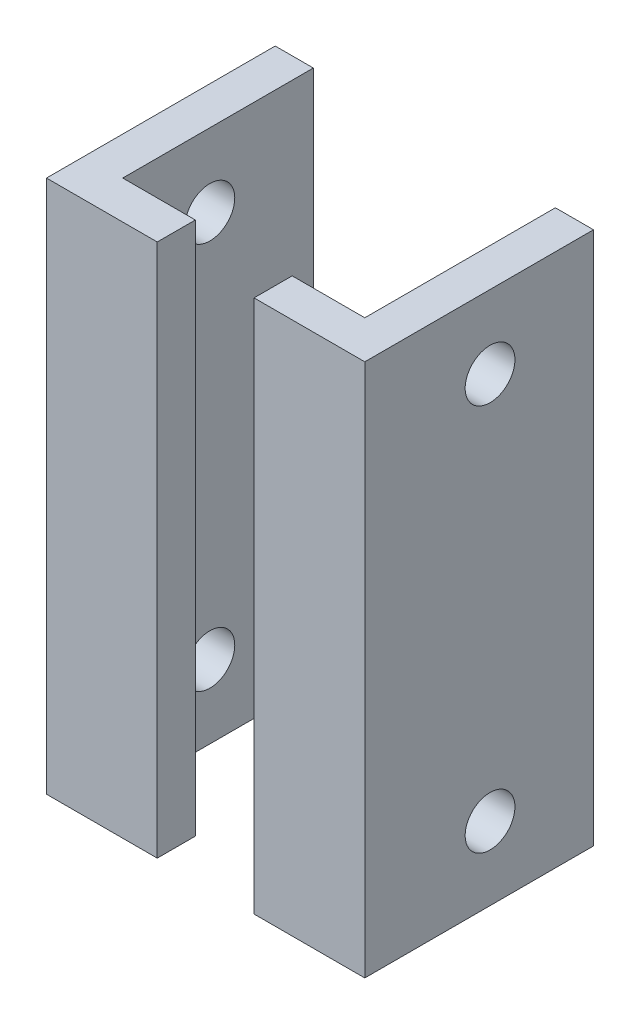
ISO-10303-21;
HEADER;
FILE_DESCRIPTION(('STEP AP214'),'2;1');
FILE_NAME('part.step','',(''),(''),'','','');
FILE_SCHEMA(('AUTOMOTIVE_DESIGN { 1 0 10303 214 1 1 1 1 }'));
ENDSEC;
DATA;
#1=APPLICATION_CONTEXT('core data for automotive mechanical design processes');
#2=APPLICATION_PROTOCOL_DEFINITION('international standard','automotive_design',2000,#1);
#3=PRODUCT_CONTEXT('',#1,'mechanical');
#4=PRODUCT('Part','Part','',(#3));
#5=PRODUCT_RELATED_PRODUCT_CATEGORY('part','',(#4));
#6=PRODUCT_DEFINITION_FORMATION('','',#4);
#7=PRODUCT_DEFINITION_CONTEXT('part definition',#1,'design');
#8=PRODUCT_DEFINITION('design','',#6,#7);
#9=PRODUCT_DEFINITION_SHAPE('','',#8);
#10=(LENGTH_UNIT() NAMED_UNIT(*) SI_UNIT(.MILLI.,.METRE.));
#11=(NAMED_UNIT(*) PLANE_ANGLE_UNIT() SI_UNIT($,.RADIAN.));
#12=(NAMED_UNIT(*) SI_UNIT($,.STERADIAN.) SOLID_ANGLE_UNIT());
#13=UNCERTAINTY_MEASURE_WITH_UNIT(LENGTH_MEASURE(1.E-05),#10,'distance_accuracy_value','');
#14=(GEOMETRIC_REPRESENTATION_CONTEXT(3) GLOBAL_UNCERTAINTY_ASSIGNED_CONTEXT((#13)) GLOBAL_UNIT_ASSIGNED_CONTEXT((#10,
#11,#12)) REPRESENTATION_CONTEXT('',''));
#15=CARTESIAN_POINT('',(0.,0.,0.));
#16=DIRECTION('',(0.,0.,1.));
#17=DIRECTION('',(1.,0.,0.));
#18=AXIS2_PLACEMENT_3D('',#15,#16,#17);
#19=CARTESIAN_POINT('',(-20.875,0.,0.));
#20=DIRECTION('',(1.,0.,0.));
#21=DIRECTION('',(0.,0.,1.));
#22=AXIS2_PLACEMENT_3D('',#19,#20,#21);
#23=PLANE('',#22);
#24=DIRECTION('',(0.,-1.,0.));
#25=VECTOR('',#24,1.);
#26=CARTESIAN_POINT('',(-20.875,244.4,49.45));
#27=LINE('',#26,#25);
#28=CARTESIAN_POINT('',(-20.875,314.4,49.45));
#29=VERTEX_POINT('',#28);
#30=CARTESIAN_POINT('',(-20.875,244.4,49.45));
#31=VERTEX_POINT('',#30);
#32=EDGE_CURVE('E126',#29,#31,#27,.T.);
#33=ORIENTED_EDGE('',*,*,#32,.F.);
#34=DIRECTION('',(0.,0.,1.));
#35=VECTOR('',#34,1.);
#36=CARTESIAN_POINT('',(-20.875,314.4,49.45));
#37=LINE('',#36,#35);
#38=CARTESIAN_POINT('',(-20.875,314.4,19.45));
#39=VERTEX_POINT('',#38);
#40=EDGE_CURVE('E141',#39,#29,#37,.T.);
#41=ORIENTED_EDGE('',*,*,#40,.F.);
#42=DIRECTION('',(0.,1.,0.));
#43=VECTOR('',#42,1.);
#44=CARTESIAN_POINT('',(-20.875,314.4,19.45));
#45=LINE('',#44,#43);
#46=CARTESIAN_POINT('',(-20.875,244.4,19.45));
#47=VERTEX_POINT('',#46);
#48=EDGE_CURVE('E132',#47,#39,#45,.T.);
#49=ORIENTED_EDGE('',*,*,#48,.F.);
#50=DIRECTION('',(0.,0.,-1.));
#51=VECTOR('',#50,1.);
#52=CARTESIAN_POINT('',(-20.875,244.4,19.45));
#53=LINE('',#52,#51);
#54=EDGE_CURVE('E129',#31,#47,#53,.T.);
#55=ORIENTED_EDGE('',*,*,#54,.F.);
#56=EDGE_LOOP('',(#33,#41,#49,#55));
#57=FACE_BOUND('',#56,.T.);
#58=CARTESIAN_POINT('',(-20.875,254.,33.02));
#59=DIRECTION('',(1.,0.,0.));
#60=DIRECTION('',(0.,0.,-1.));
#61=AXIS2_PLACEMENT_3D('',#58,#59,#60);
#62=CIRCLE('',#61,3.2639);
#63=CARTESIAN_POINT('',(-20.875,254.,29.7561));
#64=VERTEX_POINT('',#63);
#65=EDGE_CURVE('E146',#64,#64,#62,.T.);
#66=ORIENTED_EDGE('',*,*,#65,.T.);
#67=EDGE_LOOP('',(#66));
#68=FACE_BOUND('',#67,.T.);
#69=CARTESIAN_POINT('',(-20.875,304.8,33.02));
#70=DIRECTION('',(1.,0.,0.));
#71=DIRECTION('',(0.,0.,-1.));
#72=AXIS2_PLACEMENT_3D('',#69,#70,#71);
#73=CIRCLE('',#72,3.2639);
#74=CARTESIAN_POINT('',(-20.875,304.8,29.7561));
#75=VERTEX_POINT('',#74);
#76=EDGE_CURVE('E165',#75,#75,#73,.T.);
#77=ORIENTED_EDGE('',*,*,#76,.T.);
#78=EDGE_LOOP('',(#77));
#79=FACE_BOUND('',#78,.T.);
#80=ADVANCED_FACE('F49',(#57,#68,#79),#23,.F.);
#81=CARTESIAN_POINT('',(-15.875,0.,0.));
#82=DIRECTION('',(1.,0.,0.));
#83=DIRECTION('',(0.,0.,1.));
#84=AXIS2_PLACEMENT_3D('',#81,#82,#83);
#85=PLANE('',#84);
#86=DIRECTION('',(0.,-1.,0.));
#87=VECTOR('',#86,1.);
#88=CARTESIAN_POINT('',(-15.875,314.4,44.45));
#89=LINE('',#88,#87);
#90=CARTESIAN_POINT('',(-15.875,314.4,44.45));
#91=VERTEX_POINT('',#90);
#92=CARTESIAN_POINT('',(-15.875,244.4,44.45));
#93=VERTEX_POINT('',#92);
#94=EDGE_CURVE('E157',#91,#93,#89,.T.);
#95=ORIENTED_EDGE('',*,*,#94,.T.);
#96=DIRECTION('',(0.,0.,-1.));
#97=VECTOR('',#96,1.);
#98=CARTESIAN_POINT('',(-15.875,244.4,19.45));
#99=LINE('',#98,#97);
#100=CARTESIAN_POINT('',(-15.875,244.4,19.45));
#101=VERTEX_POINT('',#100);
#102=EDGE_CURVE('E143',#93,#101,#99,.T.);
#103=ORIENTED_EDGE('',*,*,#102,.T.);
#104=DIRECTION('',(0.,1.,0.));
#105=VECTOR('',#104,1.);
#106=CARTESIAN_POINT('',(-15.875,314.4,19.45));
#107=LINE('',#106,#105);
#108=CARTESIAN_POINT('',(-15.875,314.4,19.45));
#109=VERTEX_POINT('',#108);
#110=EDGE_CURVE('E134',#101,#109,#107,.T.);
#111=ORIENTED_EDGE('',*,*,#110,.T.);
#112=DIRECTION('',(0.,0.,1.));
#113=VECTOR('',#112,1.);
#114=CARTESIAN_POINT('',(-15.875,314.4,49.45));
#115=LINE('',#114,#113);
#116=EDGE_CURVE('E130',#109,#91,#115,.T.);
#117=ORIENTED_EDGE('',*,*,#116,.T.);
#118=EDGE_LOOP('',(#95,#103,#111,#117));
#119=FACE_BOUND('',#118,.T.);
#120=CARTESIAN_POINT('',(-15.875,254.,33.02));
#121=DIRECTION('',(1.,0.,0.));
#122=DIRECTION('',(0.,0.,-1.));
#123=AXIS2_PLACEMENT_3D('',#120,#121,#122);
#124=CIRCLE('',#123,3.2639);
#125=CARTESIAN_POINT('',(-15.875,254.,29.7561));
#126=VERTEX_POINT('',#125);
#127=EDGE_CURVE('E137',#126,#126,#124,.T.);
#128=ORIENTED_EDGE('',*,*,#127,.F.);
#129=EDGE_LOOP('',(#128));
#130=FACE_BOUND('',#129,.T.);
#131=CARTESIAN_POINT('',(-15.875,304.8,33.02));
#132=DIRECTION('',(1.,0.,0.));
#133=DIRECTION('',(0.,0.,-1.));
#134=AXIS2_PLACEMENT_3D('',#131,#132,#133);
#135=CIRCLE('',#134,3.2639);
#136=CARTESIAN_POINT('',(-15.875,304.8,29.7561));
#137=VERTEX_POINT('',#136);
#138=EDGE_CURVE('E118',#137,#137,#135,.T.);
#139=ORIENTED_EDGE('',*,*,#138,.F.);
#140=EDGE_LOOP('',(#139));
#141=FACE_BOUND('',#140,.T.);
#142=ADVANCED_FACE('F154',(#119,#130,#141),#85,.T.);
#143=CARTESIAN_POINT('',(-20.875,244.4,49.45));
#144=DIRECTION('',(0.,0.,-1.));
#145=DIRECTION('',(0.,1.,0.));
#146=AXIS2_PLACEMENT_3D('',#143,#144,#145);
#147=PLANE('',#146);
#148=DIRECTION('',(1.,0.,0.));
#149=VECTOR('',#148,1.);
#150=CARTESIAN_POINT('',(-20.875,314.4,49.45));
#151=LINE('',#150,#149);
#152=CARTESIAN_POINT('',(-6.34999999999999,314.4,49.45));
#153=VERTEX_POINT('',#152);
#154=EDGE_CURVE('E73',#29,#153,#151,.T.);
#155=ORIENTED_EDGE('',*,*,#154,.F.);
#156=ORIENTED_EDGE('',*,*,#32,.T.);
#157=DIRECTION('',(1.,0.,0.));
#158=VECTOR('',#157,1.);
#159=CARTESIAN_POINT('',(-20.875,244.4,49.45));
#160=LINE('',#159,#158);
#161=CARTESIAN_POINT('',(-6.34999999999997,244.4,49.45));
#162=VERTEX_POINT('',#161);
#163=EDGE_CURVE('E12',#31,#162,#160,.T.);
#164=ORIENTED_EDGE('',*,*,#163,.T.);
#165=DIRECTION('',(0.,1.,0.));
#166=VECTOR('',#165,1.);
#167=CARTESIAN_POINT('',(-6.34999999999999,314.4,49.45));
#168=LINE('',#167,#166);
#169=EDGE_CURVE('E121',#162,#153,#168,.T.);
#170=ORIENTED_EDGE('',*,*,#169,.T.);
#171=EDGE_LOOP('',(#155,#156,#164,#170));
#172=FACE_BOUND('',#171,.T.);
#173=ADVANCED_FACE('F51',(#172),#147,.F.);
#174=CARTESIAN_POINT('',(-20.875,244.4,19.45));
#175=DIRECTION('',(0.,1.,0.));
#176=DIRECTION('',(0.,0.,1.));
#177=AXIS2_PLACEMENT_3D('',#174,#175,#176);
#178=PLANE('',#177);
#179=ORIENTED_EDGE('',*,*,#163,.F.);
#180=ORIENTED_EDGE('',*,*,#54,.T.);
#181=DIRECTION('',(1.,0.,0.));
#182=VECTOR('',#181,1.);
#183=CARTESIAN_POINT('',(-20.875,244.4,19.45));
#184=LINE('',#183,#182);
#185=EDGE_CURVE('E57',#47,#101,#184,.T.);
#186=ORIENTED_EDGE('',*,*,#185,.T.);
#187=ORIENTED_EDGE('',*,*,#102,.F.);
#188=DIRECTION('',(-1.,0.,0.));
#189=VECTOR('',#188,1.);
#190=CARTESIAN_POINT('',(63.8283442380911,244.4,44.45));
#191=LINE('',#190,#189);
#192=CARTESIAN_POINT('',(-6.34999999999997,244.4,44.45));
#193=VERTEX_POINT('',#192);
#194=EDGE_CURVE('E116',#193,#93,#191,.T.);
#195=ORIENTED_EDGE('',*,*,#194,.F.);
#196=DIRECTION('',(0.,0.,1.));
#197=VECTOR('',#196,1.);
#198=CARTESIAN_POINT('',(-6.34999999999999,244.4,44.45));
#199=LINE('',#198,#197);
#200=EDGE_CURVE('E112',#193,#162,#199,.T.);
#201=ORIENTED_EDGE('',*,*,#200,.T.);
#202=EDGE_LOOP('',(#179,#180,#186,#187,#195,#201));
#203=FACE_BOUND('',#202,.T.);
#204=ADVANCED_FACE('F114',(#203),#178,.F.);
#205=CARTESIAN_POINT('',(-20.875,314.4,19.45));
#206=DIRECTION('',(0.,0.,1.));
#207=DIRECTION('',(0.,-1.,0.));
#208=AXIS2_PLACEMENT_3D('',#205,#206,#207);
#209=PLANE('',#208);
#210=ORIENTED_EDGE('',*,*,#110,.F.);
#211=ORIENTED_EDGE('',*,*,#185,.F.);
#212=ORIENTED_EDGE('',*,*,#48,.T.);
#213=DIRECTION('',(1.,0.,0.));
#214=VECTOR('',#213,1.);
#215=CARTESIAN_POINT('',(-20.875,314.4,19.45));
#216=LINE('',#215,#214);
#217=EDGE_CURVE('E89',#39,#109,#216,.T.);
#218=ORIENTED_EDGE('',*,*,#217,.T.);
#219=EDGE_LOOP('',(#210,#211,#212,#218));
#220=FACE_BOUND('',#219,.T.);
#221=ADVANCED_FACE('F152',(#220),#209,.F.);
#222=CARTESIAN_POINT('',(-20.875,314.4,49.45));
#223=DIRECTION('',(0.,-1.,0.));
#224=DIRECTION('',(0.,0.,-1.));
#225=AXIS2_PLACEMENT_3D('',#222,#223,#224);
#226=PLANE('',#225);
#227=ORIENTED_EDGE('',*,*,#116,.F.);
#228=ORIENTED_EDGE('',*,*,#217,.F.);
#229=ORIENTED_EDGE('',*,*,#40,.T.);
#230=ORIENTED_EDGE('',*,*,#154,.T.);
#231=DIRECTION('',(0.,0.,-1.));
#232=VECTOR('',#231,1.);
#233=CARTESIAN_POINT('',(-6.34999999999999,314.4,49.45));
#234=LINE('',#233,#232);
#235=CARTESIAN_POINT('',(-6.34999999999997,314.4,44.45));
#236=VERTEX_POINT('',#235);
#237=EDGE_CURVE('E123',#153,#236,#234,.T.);
#238=ORIENTED_EDGE('',*,*,#237,.T.);
#239=DIRECTION('',(-1.,0.,0.));
#240=VECTOR('',#239,1.);
#241=CARTESIAN_POINT('',(63.8283442380911,314.4,44.45));
#242=LINE('',#241,#240);
#243=EDGE_CURVE('E64',#236,#91,#242,.T.);
#244=ORIENTED_EDGE('',*,*,#243,.T.);
#245=EDGE_LOOP('',(#227,#228,#229,#230,#238,#244));
#246=FACE_BOUND('',#245,.T.);
#247=ADVANCED_FACE('F191',(#246),#226,.F.);
#248=CARTESIAN_POINT('',(-20.875,254.,33.02));
#249=DIRECTION('',(1.,0.,0.));
#250=DIRECTION('',(0.,0.,1.));
#251=AXIS2_PLACEMENT_3D('',#248,#249,#250);
#252=CYLINDRICAL_SURFACE('',#251,3.2639);
#253=ORIENTED_EDGE('',*,*,#65,.F.);
#254=EDGE_LOOP('',(#253));
#255=FACE_BOUND('',#254,.T.);
#256=ORIENTED_EDGE('',*,*,#127,.T.);
#257=EDGE_LOOP('',(#256));
#258=FACE_BOUND('',#257,.T.);
#259=ADVANCED_FACE('F175',(#255,#258),#252,.F.);
#260=CARTESIAN_POINT('',(-20.875,304.8,33.02));
#261=DIRECTION('',(1.,0.,0.));
#262=DIRECTION('',(0.,0.,1.));
#263=AXIS2_PLACEMENT_3D('',#260,#261,#262);
#264=CYLINDRICAL_SURFACE('',#263,3.2639);
#265=ORIENTED_EDGE('',*,*,#76,.F.);
#266=EDGE_LOOP('',(#265));
#267=FACE_BOUND('',#266,.T.);
#268=ORIENTED_EDGE('',*,*,#138,.T.);
#269=EDGE_LOOP('',(#268));
#270=FACE_BOUND('',#269,.T.);
#271=ADVANCED_FACE('F181',(#267,#270),#264,.F.);
#272=CARTESIAN_POINT('',(63.8283442380911,314.4,44.45));
#273=DIRECTION('',(0.,0.,1.));
#274=DIRECTION('',(0.,-1.,0.));
#275=AXIS2_PLACEMENT_3D('',#272,#273,#274);
#276=PLANE('',#275);
#277=DIRECTION('',(0.,-1.,0.));
#278=VECTOR('',#277,1.);
#279=CARTESIAN_POINT('',(-6.34999999999999,314.4,44.45));
#280=LINE('',#279,#278);
#281=EDGE_CURVE('E119',#236,#193,#280,.T.);
#282=ORIENTED_EDGE('',*,*,#281,.T.);
#283=ORIENTED_EDGE('',*,*,#194,.T.);
#284=ORIENTED_EDGE('',*,*,#94,.F.);
#285=ORIENTED_EDGE('',*,*,#243,.F.);
#286=EDGE_LOOP('',(#282,#283,#284,#285));
#287=FACE_BOUND('',#286,.T.);
#288=ADVANCED_FACE('F183',(#287),#276,.F.);
#289=CARTESIAN_POINT('',(-6.35,0.,0.));
#290=DIRECTION('',(1.,0.,0.));
#291=DIRECTION('',(0.,0.,1.));
#292=AXIS2_PLACEMENT_3D('',#289,#290,#291);
#293=PLANE('',#292);
#294=ORIENTED_EDGE('',*,*,#169,.F.);
#295=ORIENTED_EDGE('',*,*,#200,.F.);
#296=ORIENTED_EDGE('',*,*,#281,.F.);
#297=ORIENTED_EDGE('',*,*,#237,.F.);
#298=EDGE_LOOP('',(#294,#295,#296,#297));
#299=FACE_BOUND('',#298,.T.);
#300=ADVANCED_FACE('F122',(#299),#293,.T.);
#301=CLOSED_SHELL('',(#80,#142,#173,#204,#221,#247,#259,#271,#288,#300));
#302=MANIFOLD_SOLID_BREP('B2',#301);
#303=CARTESIAN_POINT('',(20.875,0.,0.));
#304=DIRECTION('',(-1.,0.,0.));
#305=DIRECTION('',(0.,0.,1.));
#306=AXIS2_PLACEMENT_3D('',#303,#304,#305);
#307=PLANE('',#306);
#308=DIRECTION('',(0.,-1.,0.));
#309=VECTOR('',#308,1.);
#310=CARTESIAN_POINT('',(20.875,244.4,49.45));
#311=LINE('',#310,#309);
#312=CARTESIAN_POINT('',(20.875,314.4,49.45));
#313=VERTEX_POINT('',#312);
#314=CARTESIAN_POINT('',(20.875,244.4,49.45));
#315=VERTEX_POINT('',#314);
#316=EDGE_CURVE('E379',#313,#315,#311,.T.);
#317=ORIENTED_EDGE('',*,*,#316,.T.);
#318=DIRECTION('',(0.,0.,-1.));
#319=VECTOR('',#318,1.);
#320=CARTESIAN_POINT('',(20.875,244.4,19.45));
#321=LINE('',#320,#319);
#322=CARTESIAN_POINT('',(20.875,244.4,19.45));
#323=VERTEX_POINT('',#322);
#324=EDGE_CURVE('E323',#315,#323,#321,.T.);
#325=ORIENTED_EDGE('',*,*,#324,.T.);
#326=DIRECTION('',(0.,1.,0.));
#327=VECTOR('',#326,1.);
#328=CARTESIAN_POINT('',(20.875,314.4,19.45));
#329=LINE('',#328,#327);
#330=CARTESIAN_POINT('',(20.875,314.4,19.45));
#331=VERTEX_POINT('',#330);
#332=EDGE_CURVE('E383',#323,#331,#329,.T.);
#333=ORIENTED_EDGE('',*,*,#332,.T.);
#334=DIRECTION('',(0.,0.,1.));
#335=VECTOR('',#334,1.);
#336=CARTESIAN_POINT('',(20.875,314.4,49.45));
#337=LINE('',#336,#335);
#338=EDGE_CURVE('E300',#331,#313,#337,.T.);
#339=ORIENTED_EDGE('',*,*,#338,.T.);
#340=EDGE_LOOP('',(#317,#325,#333,#339));
#341=FACE_BOUND('',#340,.T.);
#342=CARTESIAN_POINT('',(20.875,254.,33.02));
#343=DIRECTION('',(1.,0.,0.));
#344=DIRECTION('',(0.,0.,-1.));
#345=AXIS2_PLACEMENT_3D('',#342,#343,#344);
#346=CIRCLE('',#345,3.2639);
#347=CARTESIAN_POINT('',(20.875,254.,29.7561));
#348=VERTEX_POINT('',#347);
#349=EDGE_CURVE('E373',#348,#348,#346,.T.);
#350=ORIENTED_EDGE('',*,*,#349,.F.);
#351=EDGE_LOOP('',(#350));
#352=FACE_BOUND('',#351,.T.);
#353=CARTESIAN_POINT('',(20.875,304.8,33.02));
#354=DIRECTION('',(1.,0.,0.));
#355=DIRECTION('',(0.,0.,-1.));
#356=AXIS2_PLACEMENT_3D('',#353,#354,#355);
#357=CIRCLE('',#356,3.2639);
#358=CARTESIAN_POINT('',(20.875,304.8,29.7561));
#359=VERTEX_POINT('',#358);
#360=EDGE_CURVE('E360',#359,#359,#357,.T.);
#361=ORIENTED_EDGE('',*,*,#360,.F.);
#362=EDGE_LOOP('',(#361));
#363=FACE_BOUND('',#362,.T.);
#364=ADVANCED_FACE('F276',(#341,#352,#363),#307,.F.);
#365=CARTESIAN_POINT('',(15.875,0.,0.));
#366=DIRECTION('',(-1.,0.,0.));
#367=DIRECTION('',(0.,0.,1.));
#368=AXIS2_PLACEMENT_3D('',#365,#366,#367);
#369=PLANE('',#368);
#370=DIRECTION('',(0.,-1.,0.));
#371=VECTOR('',#370,1.);
#372=CARTESIAN_POINT('',(15.875,314.4,44.45));
#373=LINE('',#372,#371);
#374=CARTESIAN_POINT('',(15.875,314.4,44.45));
#375=VERTEX_POINT('',#374);
#376=CARTESIAN_POINT('',(15.875,244.4,44.45));
#377=VERTEX_POINT('',#376);
#378=EDGE_CURVE('E291',#375,#377,#373,.T.);
#379=ORIENTED_EDGE('',*,*,#378,.F.);
#380=DIRECTION('',(0.,0.,1.));
#381=VECTOR('',#380,1.);
#382=CARTESIAN_POINT('',(15.875,314.4,49.45));
#383=LINE('',#382,#381);
#384=CARTESIAN_POINT('',(15.875,314.4,19.45));
#385=VERTEX_POINT('',#384);
#386=EDGE_CURVE('E381',#385,#375,#383,.T.);
#387=ORIENTED_EDGE('',*,*,#386,.F.);
#388=DIRECTION('',(0.,1.,0.));
#389=VECTOR('',#388,1.);
#390=CARTESIAN_POINT('',(15.875,314.4,19.45));
#391=LINE('',#390,#389);
#392=CARTESIAN_POINT('',(15.875,244.4,19.45));
#393=VERTEX_POINT('',#392);
#394=EDGE_CURVE('E316',#393,#385,#391,.T.);
#395=ORIENTED_EDGE('',*,*,#394,.F.);
#396=DIRECTION('',(0.,0.,-1.));
#397=VECTOR('',#396,1.);
#398=CARTESIAN_POINT('',(15.875,244.4,19.45));
#399=LINE('',#398,#397);
#400=EDGE_CURVE('E376',#377,#393,#399,.T.);
#401=ORIENTED_EDGE('',*,*,#400,.F.);
#402=EDGE_LOOP('',(#379,#387,#395,#401));
#403=FACE_BOUND('',#402,.T.);
#404=CARTESIAN_POINT('',(15.875,254.,33.02));
#405=DIRECTION('',(1.,0.,0.));
#406=DIRECTION('',(0.,0.,-1.));
#407=AXIS2_PLACEMENT_3D('',#404,#405,#406);
#408=CIRCLE('',#407,3.2639);
#409=CARTESIAN_POINT('',(15.875,254.,29.7561));
#410=VERTEX_POINT('',#409);
#411=EDGE_CURVE('E371',#410,#410,#408,.T.);
#412=ORIENTED_EDGE('',*,*,#411,.T.);
#413=EDGE_LOOP('',(#412));
#414=FACE_BOUND('',#413,.T.);
#415=CARTESIAN_POINT('',(15.875,304.8,33.02));
#416=DIRECTION('',(1.,0.,0.));
#417=DIRECTION('',(0.,0.,-1.));
#418=AXIS2_PLACEMENT_3D('',#415,#416,#417);
#419=CIRCLE('',#418,3.2639);
#420=CARTESIAN_POINT('',(15.875,304.8,29.7561));
#421=VERTEX_POINT('',#420);
#422=EDGE_CURVE('E357',#421,#421,#419,.T.);
#423=ORIENTED_EDGE('',*,*,#422,.T.);
#424=EDGE_LOOP('',(#423));
#425=FACE_BOUND('',#424,.T.);
#426=ADVANCED_FACE('F393',(#403,#414,#425),#369,.T.);
#427=CARTESIAN_POINT('',(20.875,244.4,49.45));
#428=DIRECTION('',(0.,0.,-1.));
#429=DIRECTION('',(0.,1.,0.));
#430=AXIS2_PLACEMENT_3D('',#427,#428,#429);
#431=PLANE('',#430);
#432=DIRECTION('',(-1.,0.,0.));
#433=VECTOR('',#432,1.);
#434=CARTESIAN_POINT('',(20.875,314.4,49.45));
#435=LINE('',#434,#433);
#436=CARTESIAN_POINT('',(6.34999999999999,314.4,49.45));
#437=VERTEX_POINT('',#436);
#438=EDGE_CURVE('E347',#313,#437,#435,.T.);
#439=ORIENTED_EDGE('',*,*,#438,.T.);
#440=DIRECTION('',(0.,1.,0.));
#441=VECTOR('',#440,1.);
#442=CARTESIAN_POINT('',(6.34999999999999,314.4,49.45));
#443=LINE('',#442,#441);
#444=CARTESIAN_POINT('',(6.34999999999997,244.4,49.45));
#445=VERTEX_POINT('',#444);
#446=EDGE_CURVE('E346',#445,#437,#443,.T.);
#447=ORIENTED_EDGE('',*,*,#446,.F.);
#448=DIRECTION('',(-1.,0.,0.));
#449=VECTOR('',#448,1.);
#450=CARTESIAN_POINT('',(20.875,244.4,49.45));
#451=LINE('',#450,#449);
#452=EDGE_CURVE('E47',#315,#445,#451,.T.);
#453=ORIENTED_EDGE('',*,*,#452,.F.);
#454=ORIENTED_EDGE('',*,*,#316,.F.);
#455=EDGE_LOOP('',(#439,#447,#453,#454));
#456=FACE_BOUND('',#455,.T.);
#457=ADVANCED_FACE('F278',(#456),#431,.F.);
#458=CARTESIAN_POINT('',(20.875,244.4,19.45));
#459=DIRECTION('',(0.,1.,0.));
#460=DIRECTION('',(0.,0.,1.));
#461=AXIS2_PLACEMENT_3D('',#458,#459,#460);
#462=PLANE('',#461);
#463=ORIENTED_EDGE('',*,*,#452,.T.);
#464=DIRECTION('',(0.,0.,1.));
#465=VECTOR('',#464,1.);
#466=CARTESIAN_POINT('',(6.34999999999999,244.4,44.45));
#467=LINE('',#466,#465);
#468=CARTESIAN_POINT('',(6.34999999999997,244.4,44.45));
#469=VERTEX_POINT('',#468);
#470=EDGE_CURVE('E341',#469,#445,#467,.T.);
#471=ORIENTED_EDGE('',*,*,#470,.F.);
#472=DIRECTION('',(1.,0.,0.));
#473=VECTOR('',#472,1.);
#474=CARTESIAN_POINT('',(-63.8283442380911,244.4,44.45));
#475=LINE('',#474,#473);
#476=EDGE_CURVE('E352',#469,#377,#475,.T.);
#477=ORIENTED_EDGE('',*,*,#476,.T.);
#478=ORIENTED_EDGE('',*,*,#400,.T.);
#479=DIRECTION('',(-1.,0.,0.));
#480=VECTOR('',#479,1.);
#481=CARTESIAN_POINT('',(20.875,244.4,19.45));
#482=LINE('',#481,#480);
#483=EDGE_CURVE('E284',#323,#393,#482,.T.);
#484=ORIENTED_EDGE('',*,*,#483,.F.);
#485=ORIENTED_EDGE('',*,*,#324,.F.);
#486=EDGE_LOOP('',(#463,#471,#477,#478,#484,#485));
#487=FACE_BOUND('',#486,.T.);
#488=ADVANCED_FACE('F338',(#487),#462,.F.);
#489=CARTESIAN_POINT('',(20.875,314.4,19.45));
#490=DIRECTION('',(0.,0.,1.));
#491=DIRECTION('',(0.,-1.,0.));
#492=AXIS2_PLACEMENT_3D('',#489,#490,#491);
#493=PLANE('',#492);
#494=ORIENTED_EDGE('',*,*,#394,.T.);
#495=DIRECTION('',(-1.,0.,0.));
#496=VECTOR('',#495,1.);
#497=CARTESIAN_POINT('',(20.875,314.4,19.45));
#498=LINE('',#497,#496);
#499=EDGE_CURVE('E390',#331,#385,#498,.T.);
#500=ORIENTED_EDGE('',*,*,#499,.F.);
#501=ORIENTED_EDGE('',*,*,#332,.F.);
#502=ORIENTED_EDGE('',*,*,#483,.T.);
#503=EDGE_LOOP('',(#494,#500,#501,#502));
#504=FACE_BOUND('',#503,.T.);
#505=ADVANCED_FACE('F392',(#504),#493,.F.);
#506=CARTESIAN_POINT('',(20.875,314.4,49.45));
#507=DIRECTION('',(0.,-1.,0.));
#508=DIRECTION('',(0.,0.,-1.));
#509=AXIS2_PLACEMENT_3D('',#506,#507,#508);
#510=PLANE('',#509);
#511=ORIENTED_EDGE('',*,*,#386,.T.);
#512=DIRECTION('',(1.,0.,0.));
#513=VECTOR('',#512,1.);
#514=CARTESIAN_POINT('',(-63.8283442380911,314.4,44.45));
#515=LINE('',#514,#513);
#516=CARTESIAN_POINT('',(6.34999999999997,314.4,44.45));
#517=VERTEX_POINT('',#516);
#518=EDGE_CURVE('E366',#517,#375,#515,.T.);
#519=ORIENTED_EDGE('',*,*,#518,.F.);
#520=DIRECTION('',(0.,0.,-1.));
#521=VECTOR('',#520,1.);
#522=CARTESIAN_POINT('',(6.34999999999999,314.4,49.45));
#523=LINE('',#522,#521);
#524=EDGE_CURVE('E351',#437,#517,#523,.T.);
#525=ORIENTED_EDGE('',*,*,#524,.F.);
#526=ORIENTED_EDGE('',*,*,#438,.F.);
#527=ORIENTED_EDGE('',*,*,#338,.F.);
#528=ORIENTED_EDGE('',*,*,#499,.T.);
#529=EDGE_LOOP('',(#511,#519,#525,#526,#527,#528));
#530=FACE_BOUND('',#529,.T.);
#531=ADVANCED_FACE('F397',(#530),#510,.F.);
#532=CARTESIAN_POINT('',(20.875,254.,33.02));
#533=DIRECTION('',(-1.,0.,0.));
#534=DIRECTION('',(0.,0.,1.));
#535=AXIS2_PLACEMENT_3D('',#532,#533,#534);
#536=CYLINDRICAL_SURFACE('',#535,3.2639);
#537=ORIENTED_EDGE('',*,*,#349,.T.);
#538=EDGE_LOOP('',(#537));
#539=FACE_BOUND('',#538,.T.);
#540=ORIENTED_EDGE('',*,*,#411,.F.);
#541=EDGE_LOOP('',(#540));
#542=FACE_BOUND('',#541,.T.);
#543=ADVANCED_FACE('F409',(#539,#542),#536,.F.);
#544=CARTESIAN_POINT('',(20.875,304.8,33.02));
#545=DIRECTION('',(-1.,0.,0.));
#546=DIRECTION('',(0.,0.,1.));
#547=AXIS2_PLACEMENT_3D('',#544,#545,#546);
#548=CYLINDRICAL_SURFACE('',#547,3.2639);
#549=ORIENTED_EDGE('',*,*,#360,.T.);
#550=EDGE_LOOP('',(#549));
#551=FACE_BOUND('',#550,.T.);
#552=ORIENTED_EDGE('',*,*,#422,.F.);
#553=EDGE_LOOP('',(#552));
#554=FACE_BOUND('',#553,.T.);
#555=ADVANCED_FACE('F401',(#551,#554),#548,.F.);
#556=CARTESIAN_POINT('',(-63.8283442380911,314.4,44.45));
#557=DIRECTION('',(0.,0.,1.));
#558=DIRECTION('',(0.,-1.,0.));
#559=AXIS2_PLACEMENT_3D('',#556,#557,#558);
#560=PLANE('',#559);
#561=DIRECTION('',(0.,-1.,0.));
#562=VECTOR('',#561,1.);
#563=CARTESIAN_POINT('',(6.34999999999999,314.4,44.45));
#564=LINE('',#563,#562);
#565=EDGE_CURVE('E356',#517,#469,#564,.T.);
#566=ORIENTED_EDGE('',*,*,#565,.F.);
#567=ORIENTED_EDGE('',*,*,#518,.T.);
#568=ORIENTED_EDGE('',*,*,#378,.T.);
#569=ORIENTED_EDGE('',*,*,#476,.F.);
#570=EDGE_LOOP('',(#566,#567,#568,#569));
#571=FACE_BOUND('',#570,.T.);
#572=ADVANCED_FACE('F399',(#571),#560,.F.);
#573=CARTESIAN_POINT('',(6.35,0.,0.));
#574=DIRECTION('',(-1.,0.,0.));
#575=DIRECTION('',(0.,0.,1.));
#576=AXIS2_PLACEMENT_3D('',#573,#574,#575);
#577=PLANE('',#576);
#578=ORIENTED_EDGE('',*,*,#446,.T.);
#579=ORIENTED_EDGE('',*,*,#524,.T.);
#580=ORIENTED_EDGE('',*,*,#565,.T.);
#581=ORIENTED_EDGE('',*,*,#470,.T.);
#582=EDGE_LOOP('',(#578,#579,#580,#581));
#583=FACE_BOUND('',#582,.T.);
#584=ADVANCED_FACE('F355',(#583),#577,.T.);
#585=CLOSED_SHELL('',(#364,#426,#457,#488,#505,#531,#543,#555,#572,#584));
#586=MANIFOLD_SOLID_BREP('B6',#585);
#587=ADVANCED_BREP_SHAPE_REPRESENTATION('',(#18,#302,#586),#14);
#588=SHAPE_DEFINITION_REPRESENTATION(#9,#587);
ENDSEC;
END-ISO-10303-21;
